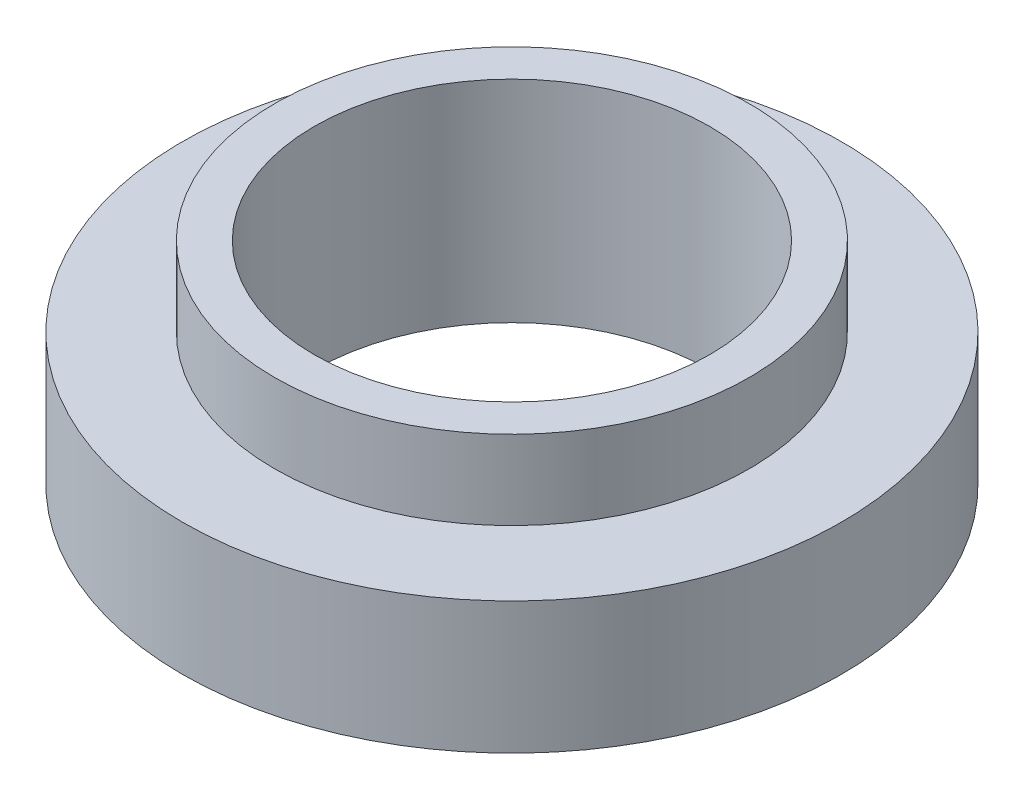
ISO-10303-21;
HEADER;
FILE_DESCRIPTION(('STEP AP214'),'2;1');
FILE_NAME('part.step','',(''),(''),'','','');
FILE_SCHEMA(('AUTOMOTIVE_DESIGN { 1 0 10303 214 1 1 1 1 }'));
ENDSEC;
DATA;
#1=APPLICATION_CONTEXT('core data for automotive mechanical design processes');
#2=APPLICATION_PROTOCOL_DEFINITION('international standard','automotive_design',2000,#1);
#3=PRODUCT_CONTEXT('',#1,'mechanical');
#4=PRODUCT('Part','Part','',(#3));
#5=PRODUCT_RELATED_PRODUCT_CATEGORY('part','',(#4));
#6=PRODUCT_DEFINITION_FORMATION('','',#4);
#7=PRODUCT_DEFINITION_CONTEXT('part definition',#1,'design');
#8=PRODUCT_DEFINITION('design','',#6,#7);
#9=PRODUCT_DEFINITION_SHAPE('','',#8);
#10=(LENGTH_UNIT() NAMED_UNIT(*) SI_UNIT(.MILLI.,.METRE.));
#11=(NAMED_UNIT(*) PLANE_ANGLE_UNIT() SI_UNIT($,.RADIAN.));
#12=(NAMED_UNIT(*) SI_UNIT($,.STERADIAN.) SOLID_ANGLE_UNIT());
#13=UNCERTAINTY_MEASURE_WITH_UNIT(LENGTH_MEASURE(1.E-05),#10,'distance_accuracy_value','');
#14=(GEOMETRIC_REPRESENTATION_CONTEXT(3) GLOBAL_UNCERTAINTY_ASSIGNED_CONTEXT((#13)) GLOBAL_UNIT_ASSIGNED_CONTEXT((#10,
#11,#12)) REPRESENTATION_CONTEXT('',''));
#15=CARTESIAN_POINT('',(0.,0.,0.));
#16=DIRECTION('',(0.,0.,1.));
#17=DIRECTION('',(1.,0.,0.));
#18=AXIS2_PLACEMENT_3D('',#15,#16,#17);
#19=CARTESIAN_POINT('',(0.,5.,0.));
#20=DIRECTION('',(0.,-1.,0.));
#21=DIRECTION('',(0.,0.,-1.));
#22=AXIS2_PLACEMENT_3D('',#19,#20,#21);
#23=CYLINDRICAL_SURFACE('',#22,12.5);
#24=CARTESIAN_POINT('',(0.,5.,0.));
#25=DIRECTION('',(0.,1.,0.));
#26=DIRECTION('',(0.,0.,1.));
#27=AXIS2_PLACEMENT_3D('',#24,#25,#26);
#28=CIRCLE('',#27,12.5);
#29=CARTESIAN_POINT('',(0.,5.,12.5));
#30=VERTEX_POINT('',#29);
#31=EDGE_CURVE('E12',#30,#30,#28,.T.);
#32=ORIENTED_EDGE('',*,*,#31,.F.);
#33=EDGE_LOOP('',(#32));
#34=FACE_BOUND('',#33,.T.);
#35=CARTESIAN_POINT('',(0.,0.,0.));
#36=DIRECTION('',(0.,1.,0.));
#37=DIRECTION('',(0.,0.,1.));
#38=AXIS2_PLACEMENT_3D('',#35,#36,#37);
#39=CIRCLE('',#38,12.5);
#40=CARTESIAN_POINT('',(0.,0.,12.5));
#41=VERTEX_POINT('',#40);
#42=EDGE_CURVE('E47',#41,#41,#39,.T.);
#43=ORIENTED_EDGE('',*,*,#42,.T.);
#44=EDGE_LOOP('',(#43));
#45=FACE_BOUND('',#44,.T.);
#46=ADVANCED_FACE('F44',(#34,#45),#23,.T.);
#47=CARTESIAN_POINT('',(0.,5.,0.));
#48=DIRECTION('',(0.,1.,0.));
#49=DIRECTION('',(0.,0.,1.));
#50=AXIS2_PLACEMENT_3D('',#47,#48,#49);
#51=PLANE('',#50);
#52=CARTESIAN_POINT('',(0.,5.,0.));
#53=DIRECTION('',(0.,1.,0.));
#54=DIRECTION('',(0.,0.,1.));
#55=AXIS2_PLACEMENT_3D('',#52,#53,#54);
#56=CIRCLE('',#55,9.);
#57=CARTESIAN_POINT('',(0.,5.,9.));
#58=VERTEX_POINT('',#57);
#59=EDGE_CURVE('E56',#58,#58,#56,.T.);
#60=ORIENTED_EDGE('',*,*,#59,.F.);
#61=EDGE_LOOP('',(#60));
#62=FACE_BOUND('',#61,.T.);
#63=ORIENTED_EDGE('',*,*,#31,.T.);
#64=EDGE_LOOP('',(#63));
#65=FACE_BOUND('',#64,.T.);
#66=ADVANCED_FACE('F84',(#62,#65),#51,.T.);
#67=CARTESIAN_POINT('',(0.,0.,0.));
#68=DIRECTION('',(0.,1.,0.));
#69=DIRECTION('',(0.,0.,1.));
#70=AXIS2_PLACEMENT_3D('',#67,#68,#69);
#71=PLANE('',#70);
#72=CARTESIAN_POINT('',(0.,0.,0.));
#73=DIRECTION('',(0.,1.,0.));
#74=DIRECTION('',(0.,0.,1.));
#75=AXIS2_PLACEMENT_3D('',#72,#73,#74);
#76=CIRCLE('',#75,7.5);
#77=CARTESIAN_POINT('',(0.,0.,7.5));
#78=VERTEX_POINT('',#77);
#79=EDGE_CURVE('E59',#78,#78,#76,.T.);
#80=ORIENTED_EDGE('',*,*,#79,.T.);
#81=EDGE_LOOP('',(#80));
#82=FACE_BOUND('',#81,.T.);
#83=ORIENTED_EDGE('',*,*,#42,.F.);
#84=EDGE_LOOP('',(#83));
#85=FACE_BOUND('',#84,.T.);
#86=ADVANCED_FACE('F80',(#82,#85),#71,.F.);
#87=CARTESIAN_POINT('',(0.,8.,0.));
#88=DIRECTION('',(0.,-1.,0.));
#89=DIRECTION('',(0.,0.,-1.));
#90=AXIS2_PLACEMENT_3D('',#87,#88,#89);
#91=CYLINDRICAL_SURFACE('',#90,9.);
#92=CARTESIAN_POINT('',(0.,8.,0.));
#93=DIRECTION('',(0.,1.,0.));
#94=DIRECTION('',(0.,0.,1.));
#95=AXIS2_PLACEMENT_3D('',#92,#93,#94);
#96=CIRCLE('',#95,9.);
#97=CARTESIAN_POINT('',(0.,8.,9.));
#98=VERTEX_POINT('',#97);
#99=EDGE_CURVE('E54',#98,#98,#96,.T.);
#100=ORIENTED_EDGE('',*,*,#99,.F.);
#101=EDGE_LOOP('',(#100));
#102=FACE_BOUND('',#101,.T.);
#103=ORIENTED_EDGE('',*,*,#59,.T.);
#104=EDGE_LOOP('',(#103));
#105=FACE_BOUND('',#104,.T.);
#106=ADVANCED_FACE('F74',(#102,#105),#91,.T.);
#107=CARTESIAN_POINT('',(0.,8.,0.));
#108=DIRECTION('',(0.,1.,0.));
#109=DIRECTION('',(0.,0.,1.));
#110=AXIS2_PLACEMENT_3D('',#107,#108,#109);
#111=PLANE('',#110);
#112=CARTESIAN_POINT('',(0.,8.,0.));
#113=DIRECTION('',(0.,1.,0.));
#114=DIRECTION('',(0.,0.,1.));
#115=AXIS2_PLACEMENT_3D('',#112,#113,#114);
#116=CIRCLE('',#115,7.5);
#117=CARTESIAN_POINT('',(0.,8.,7.5));
#118=VERTEX_POINT('',#117);
#119=EDGE_CURVE('E64',#118,#118,#116,.T.);
#120=ORIENTED_EDGE('',*,*,#119,.F.);
#121=EDGE_LOOP('',(#120));
#122=FACE_BOUND('',#121,.T.);
#123=ORIENTED_EDGE('',*,*,#99,.T.);
#124=EDGE_LOOP('',(#123));
#125=FACE_BOUND('',#124,.T.);
#126=ADVANCED_FACE('F71',(#122,#125),#111,.T.);
#127=CARTESIAN_POINT('',(0.,-5.,0.));
#128=DIRECTION('',(0.,1.,0.));
#129=DIRECTION('',(0.,0.,1.));
#130=AXIS2_PLACEMENT_3D('',#127,#128,#129);
#131=CYLINDRICAL_SURFACE('',#130,7.5);
#132=CARTESIAN_POINT('',(0.,8.,7.5));
#133=CARTESIAN_POINT('',(0.,7.91666666666667,7.5));
#134=CARTESIAN_POINT('',(0.,7.83333333333333,7.5));
#135=CARTESIAN_POINT('',(0.,7.66666666666666,7.5));
#136=CARTESIAN_POINT('',(0.,7.58333333333333,7.5));
#137=CARTESIAN_POINT('',(0.,7.41666666666666,7.5));
#138=CARTESIAN_POINT('',(0.,7.33333333333333,7.5));
#139=CARTESIAN_POINT('',(0.,7.16666666666666,7.5));
#140=CARTESIAN_POINT('',(0.,7.08333333333333,7.5));
#141=CARTESIAN_POINT('',(0.,6.91666666666666,7.5));
#142=CARTESIAN_POINT('',(0.,6.83333333333333,7.5));
#143=CARTESIAN_POINT('',(0.,6.66666666666667,7.5));
#144=CARTESIAN_POINT('',(0.,6.58333333333333,7.5));
#145=CARTESIAN_POINT('',(0.,6.41666666666667,7.5));
#146=CARTESIAN_POINT('',(0.,6.33333333333333,7.5));
#147=CARTESIAN_POINT('',(0.,6.16666666666667,7.5));
#148=CARTESIAN_POINT('',(0.,6.08333333333333,7.5));
#149=CARTESIAN_POINT('',(0.,5.91666666666666,7.5));
#150=CARTESIAN_POINT('',(0.,5.83333333333333,7.5));
#151=CARTESIAN_POINT('',(0.,5.66666666666666,7.5));
#152=CARTESIAN_POINT('',(0.,5.58333333333333,7.5));
#153=CARTESIAN_POINT('',(0.,5.41666666666667,7.5));
#154=CARTESIAN_POINT('',(0.,5.33333333333333,7.5));
#155=CARTESIAN_POINT('',(0.,5.16666666666667,7.5));
#156=CARTESIAN_POINT('',(0.,5.08333333333333,7.5));
#157=CARTESIAN_POINT('',(0.,4.91666666666667,7.5));
#158=CARTESIAN_POINT('',(0.,4.83333333333333,7.5));
#159=CARTESIAN_POINT('',(0.,4.66666666666667,7.5));
#160=CARTESIAN_POINT('',(0.,4.58333333333333,7.5));
#161=CARTESIAN_POINT('',(0.,4.41666666666667,7.5));
#162=CARTESIAN_POINT('',(0.,4.33333333333333,7.5));
#163=CARTESIAN_POINT('',(0.,4.16666666666667,7.5));
#164=CARTESIAN_POINT('',(0.,4.08333333333333,7.5));
#165=CARTESIAN_POINT('',(0.,3.91666666666666,7.5));
#166=CARTESIAN_POINT('',(0.,3.83333333333333,7.5));
#167=CARTESIAN_POINT('',(0.,3.66666666666666,7.5));
#168=CARTESIAN_POINT('',(0.,3.58333333333333,7.5));
#169=CARTESIAN_POINT('',(0.,3.41666666666666,7.5));
#170=CARTESIAN_POINT('',(0.,3.33333333333333,7.5));
#171=CARTESIAN_POINT('',(0.,3.16666666666666,7.5));
#172=CARTESIAN_POINT('',(0.,3.08333333333333,7.5));
#173=CARTESIAN_POINT('',(0.,2.91666666666666,7.5));
#174=CARTESIAN_POINT('',(0.,2.83333333333333,7.5));
#175=CARTESIAN_POINT('',(0.,2.66666666666667,7.5));
#176=CARTESIAN_POINT('',(0.,2.58333333333333,7.5));
#177=CARTESIAN_POINT('',(0.,2.41666666666667,7.5));
#178=CARTESIAN_POINT('',(0.,2.33333333333333,7.5));
#179=CARTESIAN_POINT('',(0.,2.16666666666667,7.5));
#180=CARTESIAN_POINT('',(0.,2.08333333333333,7.5));
#181=CARTESIAN_POINT('',(0.,1.91666666666667,7.5));
#182=CARTESIAN_POINT('',(0.,1.83333333333333,7.5));
#183=CARTESIAN_POINT('',(0.,1.66666666666667,7.5));
#184=CARTESIAN_POINT('',(0.,1.58333333333333,7.5));
#185=CARTESIAN_POINT('',(0.,1.41666666666667,7.5));
#186=CARTESIAN_POINT('',(0.,1.33333333333333,7.5));
#187=CARTESIAN_POINT('',(0.,1.16666666666667,7.5));
#188=CARTESIAN_POINT('',(0.,1.08333333333333,7.5));
#189=CARTESIAN_POINT('',(0.,0.916666666666666,7.5));
#190=CARTESIAN_POINT('',(0.,0.833333333333332,7.5));
#191=CARTESIAN_POINT('',(0.,0.666666666666666,7.5));
#192=CARTESIAN_POINT('',(0.,0.583333333333333,7.5));
#193=CARTESIAN_POINT('',(0.,0.416666666666666,7.5));
#194=CARTESIAN_POINT('',(0.,0.333333333333333,7.5));
#195=CARTESIAN_POINT('',(0.,0.166666666666666,7.5));
#196=CARTESIAN_POINT('',(0.,0.0833333333333325,7.5));
#197=CARTESIAN_POINT('',(0.,0.,7.5));
#198=B_SPLINE_CURVE_WITH_KNOTS('',3,(#132,#133,#134,#135,#136,#137,#138,#139,#140,#141,#142,
#143,#144,#145,#146,#147,#148,#149,#150,#151,#152,#153,#154,#155,#156,#157,#158,#159,#160,#161,
#162,#163,#164,#165,#166,#167,#168,#169,#170,#171,#172,#173,#174,#175,#176,#177,#178,#179,#180,
#181,#182,#183,#184,#185,#186,#187,#188,#189,#190,#191,#192,#193,#194,#195,#196,#197),
.UNSPECIFIED.,.F.,.F.,(4,2,2,2,2,2,2,2,2,2,2,2,2,2,2,2,2,2,2,2,2,2,2,2,2,2,2,2,2,2,2,2,4),(0.,
0.25,0.5,0.750000000000001,1.,1.25,1.5,1.75,2.,2.25,2.5,2.75,3.,3.25,3.5,3.75,4.,4.25,4.5,4.75,
5.,5.25,5.5,5.75,6.,6.25,6.5,6.75,7.,7.25,7.5,7.75,8.),.UNSPECIFIED.);
#199=EDGE_CURVE('BSEAM68',#118,#78,#198,.T.);
#200=ORIENTED_EDGE('',*,*,#119,.T.);
#201=ORIENTED_EDGE('',*,*,#79,.F.);
#202=ORIENTED_EDGE('',*,*,#199,.T.);
#203=ORIENTED_EDGE('',*,*,#199,.F.);
#204=EDGE_LOOP('',(#200,#202,#201,#203));
#205=FACE_BOUND('',#204,.T.);
#206=ADVANCED_FACE('F68',(#205),#131,.F.);
#207=CLOSED_SHELL('',(#46,#66,#86,#106,#126,#206));
#208=MANIFOLD_SOLID_BREP('B2',#207);
#209=ADVANCED_BREP_SHAPE_REPRESENTATION('',(#18,#208),#14);
#210=SHAPE_DEFINITION_REPRESENTATION(#9,#209);
ENDSEC;
END-ISO-10303-21;
